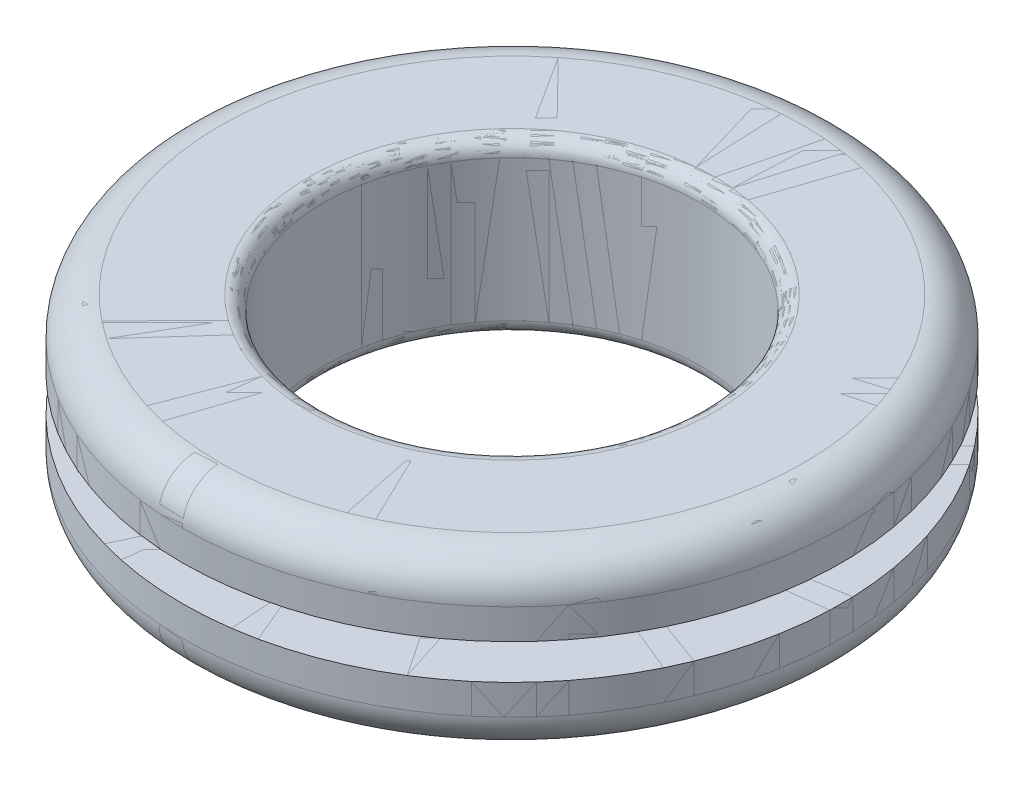
ISO-10303-21;
HEADER;
FILE_DESCRIPTION(('STEP AP214'),'2;1');
FILE_NAME('part.step','',(''),(''),'','','');
FILE_SCHEMA(('AUTOMOTIVE_DESIGN { 1 0 10303 214 1 1 1 1 }'));
ENDSEC;
DATA;
#1=APPLICATION_CONTEXT('core data for automotive mechanical design processes');
#2=APPLICATION_PROTOCOL_DEFINITION('international standard','automotive_design',2000,#1);
#3=PRODUCT_CONTEXT('',#1,'mechanical');
#4=PRODUCT('Part','Part','',(#3));
#5=PRODUCT_RELATED_PRODUCT_CATEGORY('part','',(#4));
#6=PRODUCT_DEFINITION_FORMATION('','',#4);
#7=PRODUCT_DEFINITION_CONTEXT('part definition',#1,'design');
#8=PRODUCT_DEFINITION('design','',#6,#7);
#9=PRODUCT_DEFINITION_SHAPE('','',#8);
#10=(LENGTH_UNIT() NAMED_UNIT(*) SI_UNIT(.MILLI.,.METRE.));
#11=(NAMED_UNIT(*) PLANE_ANGLE_UNIT() SI_UNIT($,.RADIAN.));
#12=(NAMED_UNIT(*) SI_UNIT($,.STERADIAN.) SOLID_ANGLE_UNIT());
#13=UNCERTAINTY_MEASURE_WITH_UNIT(LENGTH_MEASURE(1.E-05),#10,'distance_accuracy_value','');
#14=(GEOMETRIC_REPRESENTATION_CONTEXT(3) GLOBAL_UNCERTAINTY_ASSIGNED_CONTEXT((#13)) GLOBAL_UNIT_ASSIGNED_CONTEXT((#10,
#11,#12)) REPRESENTATION_CONTEXT('',''));
#15=CARTESIAN_POINT('',(0.,0.,0.));
#16=DIRECTION('',(0.,0.,1.));
#17=DIRECTION('',(1.,0.,0.));
#18=AXIS2_PLACEMENT_3D('',#15,#16,#17);
#19=CARTESIAN_POINT('',(22.225,2.190625,0.));
#20=DIRECTION('',(0.,1.,0.));
#21=DIRECTION('',(0.,0.,1.));
#22=AXIS2_PLACEMENT_3D('',#19,#20,#21);
#23=PLANE('',#22);
#24=CARTESIAN_POINT('',(0.,2.190625,0.));
#25=DIRECTION('',(0.,1.,0.));
#26=DIRECTION('',(0.,0.,1.));
#27=AXIS2_PLACEMENT_3D('',#24,#25,#26);
#28=CIRCLE('',#27,22.225);
#29=CARTESIAN_POINT('',(0.,2.190625,22.225));
#30=VERTEX_POINT('',#29);
#31=EDGE_CURVE('E81',#30,#30,#28,.T.);
#32=ORIENTED_EDGE('',*,*,#31,.F.);
#33=EDGE_LOOP('',(#32));
#34=FACE_BOUND('',#33,.T.);
#35=CARTESIAN_POINT('',(0.,2.190625,0.));
#36=DIRECTION('',(0.,1.,0.));
#37=DIRECTION('',(0.,0.,1.));
#38=AXIS2_PLACEMENT_3D('',#35,#36,#37);
#39=CIRCLE('',#38,17.4625);
#40=CARTESIAN_POINT('',(0.,2.190625,17.4625));
#41=VERTEX_POINT('',#40);
#42=EDGE_CURVE('E11',#41,#41,#39,.T.);
#43=ORIENTED_EDGE('',*,*,#42,.T.);
#44=EDGE_LOOP('',(#43));
#45=FACE_BOUND('',#44,.T.);
#46=ADVANCED_FACE('F41',(#34,#45),#23,.F.);
#47=CARTESIAN_POINT('',(0.,4.7625,0.));
#48=DIRECTION('',(0.,1.,0.));
#49=DIRECTION('',(0.,0.,1.));
#50=AXIS2_PLACEMENT_3D('',#47,#48,#49);
#51=CYLINDRICAL_SURFACE('',#50,17.4625);
#52=ORIENTED_EDGE('',*,*,#42,.F.);
#53=EDGE_LOOP('',(#52));
#54=FACE_BOUND('',#53,.T.);
#55=CARTESIAN_POINT('',(0.,-0.190624999999997,0.));
#56=DIRECTION('',(0.,1.,0.));
#57=DIRECTION('',(0.,0.,1.));
#58=AXIS2_PLACEMENT_3D('',#55,#56,#57);
#59=CIRCLE('',#58,17.4625);
#60=CARTESIAN_POINT('',(0.,-0.190624999999997,17.4625));
#61=VERTEX_POINT('',#60);
#62=EDGE_CURVE('E47',#61,#61,#59,.T.);
#63=ORIENTED_EDGE('',*,*,#62,.T.);
#64=EDGE_LOOP('',(#63));
#65=FACE_BOUND('',#64,.T.);
#66=ADVANCED_FACE('F88',(#54,#65),#51,.T.);
#67=CARTESIAN_POINT('',(17.4625,-0.190624999999997,0.));
#68=DIRECTION('',(0.,-1.,0.));
#69=DIRECTION('',(0.,0.,-1.));
#70=AXIS2_PLACEMENT_3D('',#67,#68,#69);
#71=PLANE('',#70);
#72=ORIENTED_EDGE('',*,*,#62,.F.);
#73=EDGE_LOOP('',(#72));
#74=FACE_BOUND('',#73,.T.);
#75=CARTESIAN_POINT('',(0.,-0.190624999999997,0.));
#76=DIRECTION('',(0.,1.,0.));
#77=DIRECTION('',(0.,0.,1.));
#78=AXIS2_PLACEMENT_3D('',#75,#76,#77);
#79=CIRCLE('',#78,22.225);
#80=CARTESIAN_POINT('',(0.,-0.190624999999997,22.225));
#81=VERTEX_POINT('',#80);
#82=EDGE_CURVE('E51',#81,#81,#79,.T.);
#83=ORIENTED_EDGE('',*,*,#82,.T.);
#84=EDGE_LOOP('',(#83));
#85=FACE_BOUND('',#84,.T.);
#86=ADVANCED_FACE('F92',(#74,#85),#71,.F.);
#87=CARTESIAN_POINT('',(0.,4.7625,0.));
#88=DIRECTION('',(0.,1.,0.));
#89=DIRECTION('',(0.,0.,1.));
#90=AXIS2_PLACEMENT_3D('',#87,#88,#89);
#91=CYLINDRICAL_SURFACE('',#90,22.225);
#92=ORIENTED_EDGE('',*,*,#82,.F.);
#93=EDGE_LOOP('',(#92));
#94=FACE_BOUND('',#93,.T.);
#95=CARTESIAN_POINT('',(0.,-2.22250000000003,0.));
#96=DIRECTION('',(0.,1.,0.));
#97=DIRECTION('',(0.,0.,1.));
#98=AXIS2_PLACEMENT_3D('',#95,#96,#97);
#99=CIRCLE('',#98,22.225);
#100=CARTESIAN_POINT('',(0.,-2.22250000000003,22.225));
#101=VERTEX_POINT('',#100);
#102=EDGE_CURVE('E55',#101,#101,#99,.T.);
#103=ORIENTED_EDGE('',*,*,#102,.T.);
#104=EDGE_LOOP('',(#103));
#105=FACE_BOUND('',#104,.T.);
#106=ADVANCED_FACE('F97',(#94,#105),#91,.T.);
#107=CARTESIAN_POINT('',(0.,-2.2225,0.));
#108=DIRECTION('',(0.,1.,0.));
#109=DIRECTION('',(0.,0.,1.));
#110=AXIS2_PLACEMENT_3D('',#107,#108,#109);
#111=TOROIDAL_SURFACE('',#110,19.685,2.54);
#112=ORIENTED_EDGE('',*,*,#102,.F.);
#113=EDGE_LOOP('',(#112));
#114=FACE_BOUND('',#113,.T.);
#115=CARTESIAN_POINT('',(0.,-4.76249999999999,0.));
#116=DIRECTION('',(0.,1.,0.));
#117=DIRECTION('',(0.,0.,1.));
#118=AXIS2_PLACEMENT_3D('',#115,#116,#117);
#119=CIRCLE('',#118,19.685);
#120=CARTESIAN_POINT('',(0.,-4.76249999999999,19.685));
#121=VERTEX_POINT('',#120);
#122=EDGE_CURVE('E60',#121,#121,#119,.T.);
#123=ORIENTED_EDGE('',*,*,#122,.T.);
#124=EDGE_LOOP('',(#123));
#125=FACE_BOUND('',#124,.T.);
#126=ADVANCED_FACE('F103',(#114,#125),#111,.T.);
#127=CARTESIAN_POINT('',(19.685,-4.7625,0.));
#128=DIRECTION('',(0.,1.,0.));
#129=DIRECTION('',(0.,0.,1.));
#130=AXIS2_PLACEMENT_3D('',#127,#128,#129);
#131=PLANE('',#130);
#132=ORIENTED_EDGE('',*,*,#122,.F.);
#133=EDGE_LOOP('',(#132));
#134=FACE_BOUND('',#133,.T.);
#135=CARTESIAN_POINT('',(0.,-4.7625,0.));
#136=DIRECTION('',(0.,1.,0.));
#137=DIRECTION('',(0.,0.,1.));
#138=AXIS2_PLACEMENT_3D('',#135,#136,#137);
#139=CIRCLE('',#138,13.7);
#140=CARTESIAN_POINT('',(0.,-4.7625,13.7));
#141=VERTEX_POINT('',#140);
#142=EDGE_CURVE('E63',#141,#141,#139,.T.);
#143=ORIENTED_EDGE('',*,*,#142,.T.);
#144=EDGE_LOOP('',(#143));
#145=FACE_BOUND('',#144,.T.);
#146=ADVANCED_FACE('F107',(#134,#145),#131,.F.);
#147=CARTESIAN_POINT('',(0.,-3.76250000000001,0.));
#148=DIRECTION('',(0.,1.,0.));
#149=DIRECTION('',(0.,0.,1.));
#150=AXIS2_PLACEMENT_3D('',#147,#148,#149);
#151=TOROIDAL_SURFACE('',#150,13.7,0.999999999999994);
#152=ORIENTED_EDGE('',*,*,#142,.F.);
#153=EDGE_LOOP('',(#152));
#154=FACE_BOUND('',#153,.T.);
#155=CARTESIAN_POINT('',(0.,-3.7625,0.));
#156=DIRECTION('',(0.,1.,0.));
#157=DIRECTION('',(0.,0.,1.));
#158=AXIS2_PLACEMENT_3D('',#155,#156,#157);
#159=CIRCLE('',#158,12.7);
#160=CARTESIAN_POINT('',(0.,-3.7625,12.7));
#161=VERTEX_POINT('',#160);
#162=EDGE_CURVE('E66',#161,#161,#159,.T.);
#163=ORIENTED_EDGE('',*,*,#162,.T.);
#164=EDGE_LOOP('',(#163));
#165=FACE_BOUND('',#164,.T.);
#166=ADVANCED_FACE('F111',(#154,#165),#151,.T.);
#167=CARTESIAN_POINT('',(0.,4.7625,0.));
#168=DIRECTION('',(0.,1.,0.));
#169=DIRECTION('',(0.,0.,1.));
#170=AXIS2_PLACEMENT_3D('',#167,#168,#169);
#171=CYLINDRICAL_SURFACE('',#170,12.7);
#172=ORIENTED_EDGE('',*,*,#162,.F.);
#173=EDGE_LOOP('',(#172));
#174=FACE_BOUND('',#173,.T.);
#175=CARTESIAN_POINT('',(0.,5.7625,0.));
#176=DIRECTION('',(0.,1.,0.));
#177=DIRECTION('',(0.,0.,1.));
#178=AXIS2_PLACEMENT_3D('',#175,#176,#177);
#179=CIRCLE('',#178,12.7);
#180=CARTESIAN_POINT('',(0.,5.7625,12.7));
#181=VERTEX_POINT('',#180);
#182=EDGE_CURVE('E69',#181,#181,#179,.T.);
#183=ORIENTED_EDGE('',*,*,#182,.T.);
#184=EDGE_LOOP('',(#183));
#185=FACE_BOUND('',#184,.T.);
#186=ADVANCED_FACE('F115',(#174,#185),#171,.F.);
#187=CARTESIAN_POINT('',(0.,5.7625,0.));
#188=DIRECTION('',(0.,1.,0.));
#189=DIRECTION('',(0.,0.,1.));
#190=AXIS2_PLACEMENT_3D('',#187,#188,#189);
#191=TOROIDAL_SURFACE('',#190,13.7,1.);
#192=ORIENTED_EDGE('',*,*,#182,.F.);
#193=EDGE_LOOP('',(#192));
#194=FACE_BOUND('',#193,.T.);
#195=CARTESIAN_POINT('',(0.,6.76250000000001,0.));
#196=DIRECTION('',(0.,1.,0.));
#197=DIRECTION('',(0.,0.,1.));
#198=AXIS2_PLACEMENT_3D('',#195,#196,#197);
#199=CIRCLE('',#198,13.7);
#200=CARTESIAN_POINT('',(0.,6.76250000000001,13.7));
#201=VERTEX_POINT('',#200);
#202=EDGE_CURVE('E72',#201,#201,#199,.T.);
#203=ORIENTED_EDGE('',*,*,#202,.T.);
#204=EDGE_LOOP('',(#203));
#205=FACE_BOUND('',#204,.T.);
#206=ADVANCED_FACE('F119',(#194,#205),#191,.T.);
#207=CARTESIAN_POINT('',(13.7,6.76250000000001,0.));
#208=DIRECTION('',(0.,-1.,0.));
#209=DIRECTION('',(0.,0.,-1.));
#210=AXIS2_PLACEMENT_3D('',#207,#208,#209);
#211=PLANE('',#210);
#212=ORIENTED_EDGE('',*,*,#202,.F.);
#213=EDGE_LOOP('',(#212));
#214=FACE_BOUND('',#213,.T.);
#215=CARTESIAN_POINT('',(0.,6.7625,0.));
#216=DIRECTION('',(0.,1.,0.));
#217=DIRECTION('',(0.,0.,1.));
#218=AXIS2_PLACEMENT_3D('',#215,#216,#217);
#219=CIRCLE('',#218,19.685);
#220=CARTESIAN_POINT('',(0.,6.7625,19.685));
#221=VERTEX_POINT('',#220);
#222=EDGE_CURVE('E75',#221,#221,#219,.T.);
#223=ORIENTED_EDGE('',*,*,#222,.T.);
#224=EDGE_LOOP('',(#223));
#225=FACE_BOUND('',#224,.T.);
#226=ADVANCED_FACE('F123',(#214,#225),#211,.F.);
#227=CARTESIAN_POINT('',(0.,4.2225,0.));
#228=DIRECTION('',(0.,1.,0.));
#229=DIRECTION('',(0.,0.,1.));
#230=AXIS2_PLACEMENT_3D('',#227,#228,#229);
#231=TOROIDAL_SURFACE('',#230,19.685,2.54);
#232=ORIENTED_EDGE('',*,*,#222,.F.);
#233=EDGE_LOOP('',(#232));
#234=FACE_BOUND('',#233,.T.);
#235=CARTESIAN_POINT('',(0.,4.22249999999999,0.));
#236=DIRECTION('',(0.,1.,0.));
#237=DIRECTION('',(0.,0.,1.));
#238=AXIS2_PLACEMENT_3D('',#235,#236,#237);
#239=CIRCLE('',#238,22.225);
#240=CARTESIAN_POINT('',(0.,4.22249999999999,22.225));
#241=VERTEX_POINT('',#240);
#242=EDGE_CURVE('E78',#241,#241,#239,.T.);
#243=ORIENTED_EDGE('',*,*,#242,.T.);
#244=EDGE_LOOP('',(#243));
#245=FACE_BOUND('',#244,.T.);
#246=ADVANCED_FACE('F127',(#234,#245),#231,.T.);
#247=CARTESIAN_POINT('',(0.,4.7625,0.));
#248=DIRECTION('',(0.,1.,0.));
#249=DIRECTION('',(0.,0.,1.));
#250=AXIS2_PLACEMENT_3D('',#247,#248,#249);
#251=CYLINDRICAL_SURFACE('',#250,22.225);
#252=ORIENTED_EDGE('',*,*,#242,.F.);
#253=EDGE_LOOP('',(#252));
#254=FACE_BOUND('',#253,.T.);
#255=ORIENTED_EDGE('',*,*,#31,.T.);
#256=EDGE_LOOP('',(#255));
#257=FACE_BOUND('',#256,.T.);
#258=ADVANCED_FACE('F85',(#254,#257),#251,.T.);
#259=CLOSED_SHELL('',(#46,#66,#86,#106,#126,#146,#166,#186,#206,#226,#246,#258));
#260=MANIFOLD_SOLID_BREP('B2',#259);
#261=CARTESIAN_POINT('',(0.,-2.2225,0.));
#262=DIRECTION('',(0.,1.,0.));
#263=DIRECTION('',(0.,0.,1.));
#264=AXIS2_PLACEMENT_3D('',#261,#262,#263);
#265=TOROIDAL_SURFACE('',#264,19.685,2.54);
#266=CARTESIAN_POINT('',(0.,-4.7625,0.));
#267=DIRECTION('',(0.,1.,0.));
#268=DIRECTION('',(0.,0.,1.));
#269=AXIS2_PLACEMENT_3D('',#266,#267,#268);
#270=CIRCLE('',#269,19.685);
#271=CARTESIAN_POINT('',(0.,-4.7625,19.685));
#272=VERTEX_POINT('',#271);
#273=EDGE_CURVE('E263',#272,#272,#270,.T.);
#274=ORIENTED_EDGE('',*,*,#273,.T.);
#275=EDGE_LOOP('',(#274));
#276=FACE_BOUND('',#275,.T.);
#277=CARTESIAN_POINT('',(0.,-2.2225,0.));
#278=DIRECTION('',(0.,1.,0.));
#279=DIRECTION('',(0.,0.,1.));
#280=AXIS2_PLACEMENT_3D('',#277,#278,#279);
#281=CIRCLE('',#280,22.225);
#282=CARTESIAN_POINT('',(0.,-2.2225,22.225));
#283=VERTEX_POINT('',#282);
#284=EDGE_CURVE('E40',#283,#283,#281,.T.);
#285=ORIENTED_EDGE('',*,*,#284,.F.);
#286=EDGE_LOOP('',(#285));
#287=FACE_BOUND('',#286,.T.);
#288=ADVANCED_FACE('F223',(#276,#287),#265,.T.);
#289=CARTESIAN_POINT('',(0.,4.7625,0.));
#290=DIRECTION('',(0.,1.,0.));
#291=DIRECTION('',(0.,0.,1.));
#292=AXIS2_PLACEMENT_3D('',#289,#290,#291);
#293=CYLINDRICAL_SURFACE('',#292,22.225);
#294=ORIENTED_EDGE('',*,*,#284,.T.);
#295=EDGE_LOOP('',(#294));
#296=FACE_BOUND('',#295,.T.);
#297=CARTESIAN_POINT('',(0.,-0.190624999999999,0.));
#298=DIRECTION('',(0.,1.,0.));
#299=DIRECTION('',(0.,0.,1.));
#300=AXIS2_PLACEMENT_3D('',#297,#298,#299);
#301=CIRCLE('',#300,22.225);
#302=CARTESIAN_POINT('',(0.,-0.190624999999999,22.225));
#303=VERTEX_POINT('',#302);
#304=EDGE_CURVE('E229',#303,#303,#301,.T.);
#305=ORIENTED_EDGE('',*,*,#304,.F.);
#306=EDGE_LOOP('',(#305));
#307=FACE_BOUND('',#306,.T.);
#308=ADVANCED_FACE('F281',(#296,#307),#293,.T.);
#309=CARTESIAN_POINT('',(-17.4625,-0.190625,0.));
#310=DIRECTION('',(0.,1.,0.));
#311=DIRECTION('',(0.,0.,1.));
#312=AXIS2_PLACEMENT_3D('',#309,#310,#311);
#313=PLANE('',#312);
#314=ORIENTED_EDGE('',*,*,#304,.T.);
#315=EDGE_LOOP('',(#314));
#316=FACE_BOUND('',#315,.T.);
#317=CARTESIAN_POINT('',(0.,-0.190625000000002,0.));
#318=DIRECTION('',(0.,1.,0.));
#319=DIRECTION('',(0.,0.,1.));
#320=AXIS2_PLACEMENT_3D('',#317,#318,#319);
#321=CIRCLE('',#320,17.4625);
#322=CARTESIAN_POINT('',(0.,-0.190625000000002,17.4625));
#323=VERTEX_POINT('',#322);
#324=EDGE_CURVE('E233',#323,#323,#321,.T.);
#325=ORIENTED_EDGE('',*,*,#324,.F.);
#326=EDGE_LOOP('',(#325));
#327=FACE_BOUND('',#326,.T.);
#328=ADVANCED_FACE('F285',(#316,#327),#313,.T.);
#329=CARTESIAN_POINT('',(0.,4.7625,0.));
#330=DIRECTION('',(0.,1.,0.));
#331=DIRECTION('',(0.,0.,1.));
#332=AXIS2_PLACEMENT_3D('',#329,#330,#331);
#333=CYLINDRICAL_SURFACE('',#332,17.4625);
#334=ORIENTED_EDGE('',*,*,#324,.T.);
#335=EDGE_LOOP('',(#334));
#336=FACE_BOUND('',#335,.T.);
#337=CARTESIAN_POINT('',(0.,2.190625,0.));
#338=DIRECTION('',(0.,1.,0.));
#339=DIRECTION('',(0.,0.,1.));
#340=AXIS2_PLACEMENT_3D('',#337,#338,#339);
#341=CIRCLE('',#340,17.4625);
#342=CARTESIAN_POINT('',(0.,2.190625,17.4625));
#343=VERTEX_POINT('',#342);
#344=EDGE_CURVE('E237',#343,#343,#341,.T.);
#345=ORIENTED_EDGE('',*,*,#344,.F.);
#346=EDGE_LOOP('',(#345));
#347=FACE_BOUND('',#346,.T.);
#348=ADVANCED_FACE('F289',(#336,#347),#333,.T.);
#349=CARTESIAN_POINT('',(-22.225,2.190625,0.));
#350=DIRECTION('',(0.,-1.,0.));
#351=DIRECTION('',(0.,0.,-1.));
#352=AXIS2_PLACEMENT_3D('',#349,#350,#351);
#353=PLANE('',#352);
#354=ORIENTED_EDGE('',*,*,#344,.T.);
#355=EDGE_LOOP('',(#354));
#356=FACE_BOUND('',#355,.T.);
#357=CARTESIAN_POINT('',(0.,2.190625,0.));
#358=DIRECTION('',(0.,1.,0.));
#359=DIRECTION('',(0.,0.,1.));
#360=AXIS2_PLACEMENT_3D('',#357,#358,#359);
#361=CIRCLE('',#360,22.225);
#362=CARTESIAN_POINT('',(0.,2.190625,22.225));
#363=VERTEX_POINT('',#362);
#364=EDGE_CURVE('E242',#363,#363,#361,.T.);
#365=ORIENTED_EDGE('',*,*,#364,.F.);
#366=EDGE_LOOP('',(#365));
#367=FACE_BOUND('',#366,.T.);
#368=ADVANCED_FACE('F295',(#356,#367),#353,.T.);
#369=CARTESIAN_POINT('',(0.,4.7625,0.));
#370=DIRECTION('',(0.,1.,0.));
#371=DIRECTION('',(0.,0.,1.));
#372=AXIS2_PLACEMENT_3D('',#369,#370,#371);
#373=CYLINDRICAL_SURFACE('',#372,22.225);
#374=ORIENTED_EDGE('',*,*,#364,.T.);
#375=EDGE_LOOP('',(#374));
#376=FACE_BOUND('',#375,.T.);
#377=CARTESIAN_POINT('',(0.,4.2225,0.));
#378=DIRECTION('',(0.,1.,0.));
#379=DIRECTION('',(0.,0.,1.));
#380=AXIS2_PLACEMENT_3D('',#377,#378,#379);
#381=CIRCLE('',#380,22.225);
#382=CARTESIAN_POINT('',(0.,4.2225,22.225));
#383=VERTEX_POINT('',#382);
#384=EDGE_CURVE('E245',#383,#383,#381,.T.);
#385=ORIENTED_EDGE('',*,*,#384,.F.);
#386=EDGE_LOOP('',(#385));
#387=FACE_BOUND('',#386,.T.);
#388=ADVANCED_FACE('F299',(#376,#387),#373,.T.);
#389=CARTESIAN_POINT('',(0.,4.2225,0.));
#390=DIRECTION('',(0.,1.,0.));
#391=DIRECTION('',(0.,0.,1.));
#392=AXIS2_PLACEMENT_3D('',#389,#390,#391);
#393=TOROIDAL_SURFACE('',#392,19.685,2.54);
#394=ORIENTED_EDGE('',*,*,#384,.T.);
#395=EDGE_LOOP('',(#394));
#396=FACE_BOUND('',#395,.T.);
#397=CARTESIAN_POINT('',(0.,6.7625,0.));
#398=DIRECTION('',(0.,1.,0.));
#399=DIRECTION('',(0.,0.,1.));
#400=AXIS2_PLACEMENT_3D('',#397,#398,#399);
#401=CIRCLE('',#400,19.685);
#402=CARTESIAN_POINT('',(0.,6.7625,19.685));
#403=VERTEX_POINT('',#402);
#404=EDGE_CURVE('E248',#403,#403,#401,.T.);
#405=ORIENTED_EDGE('',*,*,#404,.F.);
#406=EDGE_LOOP('',(#405));
#407=FACE_BOUND('',#406,.T.);
#408=ADVANCED_FACE('F303',(#396,#407),#393,.T.);
#409=CARTESIAN_POINT('',(-13.7,6.7625,0.));
#410=DIRECTION('',(0.,1.,0.));
#411=DIRECTION('',(0.,0.,1.));
#412=AXIS2_PLACEMENT_3D('',#409,#410,#411);
#413=PLANE('',#412);
#414=ORIENTED_EDGE('',*,*,#404,.T.);
#415=EDGE_LOOP('',(#414));
#416=FACE_BOUND('',#415,.T.);
#417=CARTESIAN_POINT('',(0.,6.7625,0.));
#418=DIRECTION('',(0.,1.,0.));
#419=DIRECTION('',(0.,0.,1.));
#420=AXIS2_PLACEMENT_3D('',#417,#418,#419);
#421=CIRCLE('',#420,13.7);
#422=CARTESIAN_POINT('',(0.,6.7625,13.7));
#423=VERTEX_POINT('',#422);
#424=EDGE_CURVE('E251',#423,#423,#421,.T.);
#425=ORIENTED_EDGE('',*,*,#424,.F.);
#426=EDGE_LOOP('',(#425));
#427=FACE_BOUND('',#426,.T.);
#428=ADVANCED_FACE('F307',(#416,#427),#413,.T.);
#429=CARTESIAN_POINT('',(0.,5.7625,0.));
#430=DIRECTION('',(0.,1.,0.));
#431=DIRECTION('',(0.,0.,1.));
#432=AXIS2_PLACEMENT_3D('',#429,#430,#431);
#433=TOROIDAL_SURFACE('',#432,13.7,0.999999999999998);
#434=ORIENTED_EDGE('',*,*,#424,.T.);
#435=EDGE_LOOP('',(#434));
#436=FACE_BOUND('',#435,.T.);
#437=CARTESIAN_POINT('',(0.,5.7625,0.));
#438=DIRECTION('',(0.,1.,0.));
#439=DIRECTION('',(0.,0.,1.));
#440=AXIS2_PLACEMENT_3D('',#437,#438,#439);
#441=CIRCLE('',#440,12.7);
#442=CARTESIAN_POINT('',(0.,5.7625,12.7));
#443=VERTEX_POINT('',#442);
#444=EDGE_CURVE('E254',#443,#443,#441,.T.);
#445=ORIENTED_EDGE('',*,*,#444,.F.);
#446=EDGE_LOOP('',(#445));
#447=FACE_BOUND('',#446,.T.);
#448=ADVANCED_FACE('F311',(#436,#447),#433,.T.);
#449=CARTESIAN_POINT('',(0.,4.7625,0.));
#450=DIRECTION('',(0.,1.,0.));
#451=DIRECTION('',(0.,0.,1.));
#452=AXIS2_PLACEMENT_3D('',#449,#450,#451);
#453=CYLINDRICAL_SURFACE('',#452,12.7);
#454=ORIENTED_EDGE('',*,*,#444,.T.);
#455=EDGE_LOOP('',(#454));
#456=FACE_BOUND('',#455,.T.);
#457=CARTESIAN_POINT('',(0.,-3.7625,0.));
#458=DIRECTION('',(0.,1.,0.));
#459=DIRECTION('',(0.,0.,1.));
#460=AXIS2_PLACEMENT_3D('',#457,#458,#459);
#461=CIRCLE('',#460,12.7);
#462=CARTESIAN_POINT('',(0.,-3.7625,12.7));
#463=VERTEX_POINT('',#462);
#464=EDGE_CURVE('E257',#463,#463,#461,.T.);
#465=ORIENTED_EDGE('',*,*,#464,.F.);
#466=EDGE_LOOP('',(#465));
#467=FACE_BOUND('',#466,.T.);
#468=ADVANCED_FACE('F277',(#456,#467),#453,.F.);
#469=CARTESIAN_POINT('',(0.,-3.7625,0.));
#470=DIRECTION('',(0.,1.,0.));
#471=DIRECTION('',(0.,0.,1.));
#472=AXIS2_PLACEMENT_3D('',#469,#470,#471);
#473=TOROIDAL_SURFACE('',#472,13.7,0.999999999999997);
#474=ORIENTED_EDGE('',*,*,#464,.T.);
#475=EDGE_LOOP('',(#474));
#476=FACE_BOUND('',#475,.T.);
#477=CARTESIAN_POINT('',(0.,-4.7625,0.));
#478=DIRECTION('',(0.,1.,0.));
#479=DIRECTION('',(0.,0.,1.));
#480=AXIS2_PLACEMENT_3D('',#477,#478,#479);
#481=CIRCLE('',#480,13.7);
#482=CARTESIAN_POINT('',(0.,-4.7625,13.7));
#483=VERTEX_POINT('',#482);
#484=EDGE_CURVE('E260',#483,#483,#481,.T.);
#485=ORIENTED_EDGE('',*,*,#484,.F.);
#486=EDGE_LOOP('',(#485));
#487=FACE_BOUND('',#486,.T.);
#488=ADVANCED_FACE('F271',(#476,#487),#473,.T.);
#489=CARTESIAN_POINT('',(-19.685,-4.7625,0.));
#490=DIRECTION('',(0.,-1.,0.));
#491=DIRECTION('',(0.,0.,-1.));
#492=AXIS2_PLACEMENT_3D('',#489,#490,#491);
#493=PLANE('',#492);
#494=ORIENTED_EDGE('',*,*,#484,.T.);
#495=EDGE_LOOP('',(#494));
#496=FACE_BOUND('',#495,.T.);
#497=ORIENTED_EDGE('',*,*,#273,.F.);
#498=EDGE_LOOP('',(#497));
#499=FACE_BOUND('',#498,.T.);
#500=ADVANCED_FACE('F269',(#496,#499),#493,.T.);
#501=CLOSED_SHELL('',(#288,#308,#328,#348,#368,#388,#408,#428,#448,#468,#488,#500));
#502=MANIFOLD_SOLID_BREP('B6',#501);
#503=ADVANCED_BREP_SHAPE_REPRESENTATION('',(#18,#260,#502),#14);
#504=SHAPE_DEFINITION_REPRESENTATION(#9,#503);
ENDSEC;
END-ISO-10303-21;
